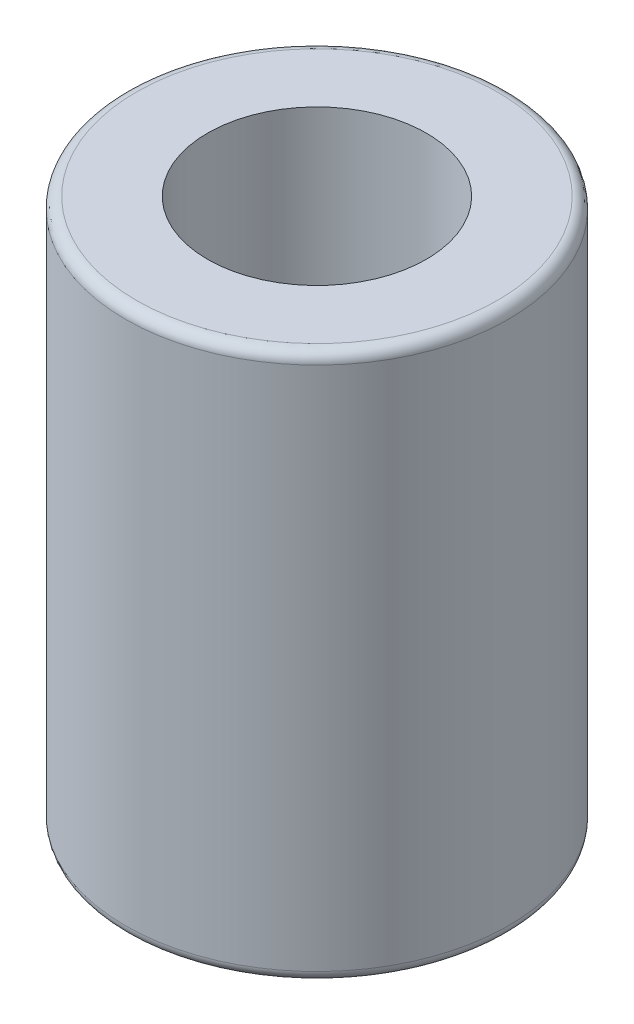
ISO-10303-21;
HEADER;
FILE_DESCRIPTION(('STEP AP214'),'2;1');
FILE_NAME('part.step','',(''),(''),'','','');
FILE_SCHEMA(('AUTOMOTIVE_DESIGN { 1 0 10303 214 1 1 1 1 }'));
ENDSEC;
DATA;
#1=APPLICATION_CONTEXT('core data for automotive mechanical design processes');
#2=APPLICATION_PROTOCOL_DEFINITION('international standard','automotive_design',2000,#1);
#3=PRODUCT_CONTEXT('',#1,'mechanical');
#4=PRODUCT('Part','Part','',(#3));
#5=PRODUCT_RELATED_PRODUCT_CATEGORY('part','',(#4));
#6=PRODUCT_DEFINITION_FORMATION('','',#4);
#7=PRODUCT_DEFINITION_CONTEXT('part definition',#1,'design');
#8=PRODUCT_DEFINITION('design','',#6,#7);
#9=PRODUCT_DEFINITION_SHAPE('','',#8);
#10=(LENGTH_UNIT() NAMED_UNIT(*) SI_UNIT(.MILLI.,.METRE.));
#11=(NAMED_UNIT(*) PLANE_ANGLE_UNIT() SI_UNIT($,.RADIAN.));
#12=(NAMED_UNIT(*) SI_UNIT($,.STERADIAN.) SOLID_ANGLE_UNIT());
#13=UNCERTAINTY_MEASURE_WITH_UNIT(LENGTH_MEASURE(1.E-05),#10,'distance_accuracy_value','');
#14=(GEOMETRIC_REPRESENTATION_CONTEXT(3) GLOBAL_UNCERTAINTY_ASSIGNED_CONTEXT((#13)) GLOBAL_UNIT_ASSIGNED_CONTEXT((#10,
#11,#12)) REPRESENTATION_CONTEXT('',''));
#15=CARTESIAN_POINT('',(0.,0.,0.));
#16=DIRECTION('',(0.,0.,1.));
#17=DIRECTION('',(1.,0.,0.));
#18=AXIS2_PLACEMENT_3D('',#15,#16,#17);
#19=CARTESIAN_POINT('',(0.,5.,0.));
#20=DIRECTION('',(0.,1.,0.));
#21=DIRECTION('',(0.,0.,1.));
#22=AXIS2_PLACEMENT_3D('',#19,#20,#21);
#23=PLANE('',#22);
#24=CARTESIAN_POINT('',(0.,5.,0.));
#25=DIRECTION('',(0.,1.,0.));
#26=DIRECTION('',(0.,0.,1.));
#27=AXIS2_PLACEMENT_3D('',#24,#25,#26);
#28=CIRCLE('',#27,3.3);
#29=CARTESIAN_POINT('',(0.,5.,3.3));
#30=VERTEX_POINT('',#29);
#31=EDGE_CURVE('E10',#30,#30,#28,.T.);
#32=ORIENTED_EDGE('',*,*,#31,.T.);
#33=EDGE_LOOP('',(#32));
#34=FACE_BOUND('',#33,.T.);
#35=CARTESIAN_POINT('',(0.,5.,0.));
#36=DIRECTION('',(0.,1.,0.));
#37=DIRECTION('',(0.,0.,1.));
#38=AXIS2_PLACEMENT_3D('',#35,#36,#37);
#39=CIRCLE('',#38,2.);
#40=CARTESIAN_POINT('',(0.,5.,2.));
#41=VERTEX_POINT('',#40);
#42=EDGE_CURVE('E52',#41,#41,#39,.T.);
#43=ORIENTED_EDGE('',*,*,#42,.F.);
#44=EDGE_LOOP('',(#43));
#45=FACE_BOUND('',#44,.T.);
#46=ADVANCED_FACE('F32',(#34,#45),#23,.T.);
#47=CARTESIAN_POINT('',(0.,-5.,0.));
#48=DIRECTION('',(0.,1.,0.));
#49=DIRECTION('',(0.,0.,1.));
#50=AXIS2_PLACEMENT_3D('',#47,#48,#49);
#51=PLANE('',#50);
#52=CARTESIAN_POINT('',(0.,-5.,0.));
#53=DIRECTION('',(0.,1.,0.));
#54=DIRECTION('',(0.,0.,1.));
#55=AXIS2_PLACEMENT_3D('',#52,#53,#54);
#56=CIRCLE('',#55,3.3);
#57=CARTESIAN_POINT('',(0.,-5.,3.3));
#58=VERTEX_POINT('',#57);
#59=EDGE_CURVE('E39',#58,#58,#56,.F.);
#60=ORIENTED_EDGE('',*,*,#59,.T.);
#61=EDGE_LOOP('',(#60));
#62=FACE_BOUND('',#61,.T.);
#63=CARTESIAN_POINT('',(0.,-5.,0.));
#64=DIRECTION('',(0.,1.,0.));
#65=DIRECTION('',(0.,0.,1.));
#66=AXIS2_PLACEMENT_3D('',#63,#64,#65);
#67=CIRCLE('',#66,2.);
#68=CARTESIAN_POINT('',(0.,-5.,2.));
#69=VERTEX_POINT('',#68);
#70=EDGE_CURVE('E53',#69,#69,#67,.T.);
#71=ORIENTED_EDGE('',*,*,#70,.T.);
#72=EDGE_LOOP('',(#71));
#73=FACE_BOUND('',#72,.T.);
#74=ADVANCED_FACE('F63',(#62,#73),#51,.F.);
#75=CARTESIAN_POINT('',(0.,5.,0.));
#76=DIRECTION('',(0.,-1.,0.));
#77=DIRECTION('',(0.,0.,-1.));
#78=AXIS2_PLACEMENT_3D('',#75,#76,#77);
#79=CYLINDRICAL_SURFACE('',#78,3.5);
#80=CARTESIAN_POINT('',(0.,-4.8,0.));
#81=DIRECTION('',(0.,1.,0.));
#82=DIRECTION('',(0.,0.,1.));
#83=AXIS2_PLACEMENT_3D('',#80,#81,#82);
#84=CIRCLE('',#83,3.5);
#85=CARTESIAN_POINT('',(0.,-4.8,3.5));
#86=VERTEX_POINT('',#85);
#87=EDGE_CURVE('E43',#86,#86,#84,.T.);
#88=ORIENTED_EDGE('',*,*,#87,.T.);
#89=EDGE_LOOP('',(#88));
#90=FACE_BOUND('',#89,.T.);
#91=CARTESIAN_POINT('',(0.,4.8,0.));
#92=DIRECTION('',(0.,1.,0.));
#93=DIRECTION('',(0.,0.,1.));
#94=AXIS2_PLACEMENT_3D('',#91,#92,#93);
#95=CIRCLE('',#94,3.5);
#96=CARTESIAN_POINT('',(0.,4.8,3.5));
#97=VERTEX_POINT('',#96);
#98=EDGE_CURVE('E47',#97,#97,#95,.F.);
#99=ORIENTED_EDGE('',*,*,#98,.T.);
#100=EDGE_LOOP('',(#99));
#101=FACE_BOUND('',#100,.T.);
#102=ADVANCED_FACE('F68',(#90,#101),#79,.T.);
#103=CARTESIAN_POINT('',(0.,5.,0.));
#104=DIRECTION('',(0.,-1.,0.));
#105=DIRECTION('',(0.,0.,-1.));
#106=AXIS2_PLACEMENT_3D('',#103,#104,#105);
#107=CYLINDRICAL_SURFACE('',#106,2.);
#108=ORIENTED_EDGE('',*,*,#42,.T.);
#109=EDGE_LOOP('',(#108));
#110=FACE_BOUND('',#109,.T.);
#111=ORIENTED_EDGE('',*,*,#70,.F.);
#112=EDGE_LOOP('',(#111));
#113=FACE_BOUND('',#112,.T.);
#114=ADVANCED_FACE('F59',(#110,#113),#107,.F.);
#115=CARTESIAN_POINT('',(0.,-4.8,0.));
#116=DIRECTION('',(0.,1.,0.));
#117=DIRECTION('',(0.,0.,1.));
#118=AXIS2_PLACEMENT_3D('',#115,#116,#117);
#119=TOROIDAL_SURFACE('',#118,3.3,0.2);
#120=ORIENTED_EDGE('',*,*,#59,.F.);
#121=EDGE_LOOP('',(#120));
#122=FACE_BOUND('',#121,.T.);
#123=ORIENTED_EDGE('',*,*,#87,.F.);
#124=EDGE_LOOP('',(#123));
#125=FACE_BOUND('',#124,.T.);
#126=ADVANCED_FACE('F74',(#122,#125),#119,.T.);
#127=CARTESIAN_POINT('',(0.,4.8,0.));
#128=DIRECTION('',(0.,1.,0.));
#129=DIRECTION('',(0.,0.,1.));
#130=AXIS2_PLACEMENT_3D('',#127,#128,#129);
#131=TOROIDAL_SURFACE('',#130,3.3,0.2);
#132=ORIENTED_EDGE('',*,*,#98,.F.);
#133=EDGE_LOOP('',(#132));
#134=FACE_BOUND('',#133,.T.);
#135=ORIENTED_EDGE('',*,*,#31,.F.);
#136=EDGE_LOOP('',(#135));
#137=FACE_BOUND('',#136,.T.);
#138=ADVANCED_FACE('F34',(#134,#137),#131,.T.);
#139=CLOSED_SHELL('',(#46,#74,#102,#114,#126,#138));
#140=MANIFOLD_SOLID_BREP('B2',#139);
#141=ADVANCED_BREP_SHAPE_REPRESENTATION('',(#18,#140),#14);
#142=SHAPE_DEFINITION_REPRESENTATION(#9,#141);
ENDSEC;
END-ISO-10303-21;
